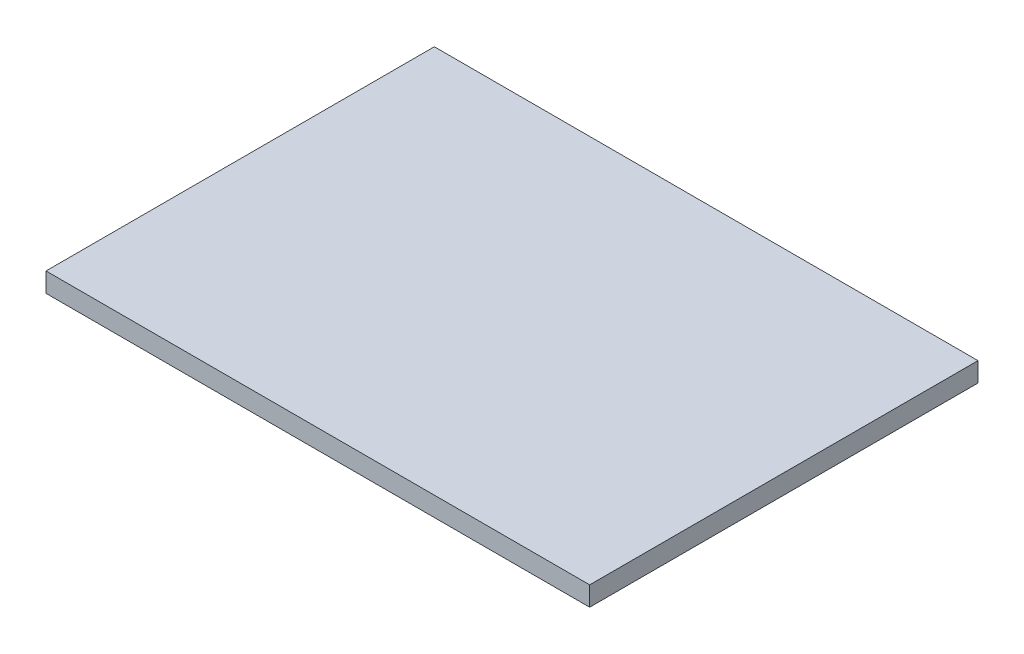
ISO-10303-21;
HEADER;
FILE_DESCRIPTION(('STEP AP214'),'2;1');
FILE_NAME('part.step','',(''),(''),'','','');
FILE_SCHEMA(('AUTOMOTIVE_DESIGN { 1 0 10303 214 1 1 1 1 }'));
ENDSEC;
DATA;
#1=APPLICATION_CONTEXT('core data for automotive mechanical design processes');
#2=APPLICATION_PROTOCOL_DEFINITION('international standard','automotive_design',2000,#1);
#3=PRODUCT_CONTEXT('',#1,'mechanical');
#4=PRODUCT('Part','Part','',(#3));
#5=PRODUCT_RELATED_PRODUCT_CATEGORY('part','',(#4));
#6=PRODUCT_DEFINITION_FORMATION('','',#4);
#7=PRODUCT_DEFINITION_CONTEXT('part definition',#1,'design');
#8=PRODUCT_DEFINITION('design','',#6,#7);
#9=PRODUCT_DEFINITION_SHAPE('','',#8);
#10=(LENGTH_UNIT() NAMED_UNIT(*) SI_UNIT(.MILLI.,.METRE.));
#11=(NAMED_UNIT(*) PLANE_ANGLE_UNIT() SI_UNIT($,.RADIAN.));
#12=(NAMED_UNIT(*) SI_UNIT($,.STERADIAN.) SOLID_ANGLE_UNIT());
#13=UNCERTAINTY_MEASURE_WITH_UNIT(LENGTH_MEASURE(1.E-05),#10,'distance_accuracy_value','');
#14=(GEOMETRIC_REPRESENTATION_CONTEXT(3) GLOBAL_UNCERTAINTY_ASSIGNED_CONTEXT((#13)) GLOBAL_UNIT_ASSIGNED_CONTEXT((#10,
#11,#12)) REPRESENTATION_CONTEXT('',''));
#15=CARTESIAN_POINT('',(0.,0.,0.));
#16=DIRECTION('',(0.,0.,1.));
#17=DIRECTION('',(1.,0.,0.));
#18=AXIS2_PLACEMENT_3D('',#15,#16,#17);
#19=CARTESIAN_POINT('',(-350.,25.,250.));
#20=DIRECTION('',(1.,0.,0.));
#21=DIRECTION('',(0.,0.,-1.));
#22=AXIS2_PLACEMENT_3D('',#19,#20,#21);
#23=PLANE('',#22);
#24=DIRECTION('',(0.,0.,1.));
#25=VECTOR('',#24,1.);
#26=CARTESIAN_POINT('',(-350.,0.,250.));
#27=LINE('',#26,#25);
#28=CARTESIAN_POINT('',(-350.,0.,-250.));
#29=VERTEX_POINT('',#28);
#30=CARTESIAN_POINT('',(-350.,0.,250.));
#31=VERTEX_POINT('',#30);
#32=EDGE_CURVE('E107',#29,#31,#27,.T.);
#33=ORIENTED_EDGE('',*,*,#32,.T.);
#34=DIRECTION('',(0.,-1.,0.));
#35=VECTOR('',#34,1.);
#36=CARTESIAN_POINT('',(-350.,25.,250.));
#37=LINE('',#36,#35);
#38=CARTESIAN_POINT('',(-350.,25.,250.));
#39=VERTEX_POINT('',#38);
#40=EDGE_CURVE('E11',#39,#31,#37,.T.);
#41=ORIENTED_EDGE('',*,*,#40,.F.);
#42=DIRECTION('',(0.,0.,1.));
#43=VECTOR('',#42,1.);
#44=CARTESIAN_POINT('',(-350.,25.,250.));
#45=LINE('',#44,#43);
#46=CARTESIAN_POINT('',(-350.,25.,-250.));
#47=VERTEX_POINT('',#46);
#48=EDGE_CURVE('E91',#47,#39,#45,.T.);
#49=ORIENTED_EDGE('',*,*,#48,.F.);
#50=DIRECTION('',(0.,-1.,0.));
#51=VECTOR('',#50,1.);
#52=CARTESIAN_POINT('',(-350.,25.,-250.));
#53=LINE('',#52,#51);
#54=EDGE_CURVE('E103',#47,#29,#53,.T.);
#55=ORIENTED_EDGE('',*,*,#54,.T.);
#56=EDGE_LOOP('',(#33,#41,#49,#55));
#57=FACE_BOUND('',#56,.T.);
#58=ADVANCED_FACE('F39',(#57),#23,.F.);
#59=CARTESIAN_POINT('',(-350.,25.,250.));
#60=DIRECTION('',(0.,0.,-1.));
#61=DIRECTION('',(-1.,0.,0.));
#62=AXIS2_PLACEMENT_3D('',#59,#60,#61);
#63=PLANE('',#62);
#64=DIRECTION('',(1.,0.,0.));
#65=VECTOR('',#64,1.);
#66=CARTESIAN_POINT('',(-350.,0.,250.));
#67=LINE('',#66,#65);
#68=CARTESIAN_POINT('',(350.,0.,250.));
#69=VERTEX_POINT('',#68);
#70=EDGE_CURVE('E96',#31,#69,#67,.T.);
#71=ORIENTED_EDGE('',*,*,#70,.T.);
#72=DIRECTION('',(0.,-1.,0.));
#73=VECTOR('',#72,1.);
#74=CARTESIAN_POINT('',(350.,25.,250.));
#75=LINE('',#74,#73);
#76=CARTESIAN_POINT('',(350.,25.,250.));
#77=VERTEX_POINT('',#76);
#78=EDGE_CURVE('E48',#77,#69,#75,.T.);
#79=ORIENTED_EDGE('',*,*,#78,.F.);
#80=DIRECTION('',(1.,0.,0.));
#81=VECTOR('',#80,1.);
#82=CARTESIAN_POINT('',(-350.,25.,250.));
#83=LINE('',#82,#81);
#84=EDGE_CURVE('E86',#39,#77,#83,.T.);
#85=ORIENTED_EDGE('',*,*,#84,.F.);
#86=ORIENTED_EDGE('',*,*,#40,.T.);
#87=EDGE_LOOP('',(#71,#79,#85,#86));
#88=FACE_BOUND('',#87,.T.);
#89=ADVANCED_FACE('F95',(#88),#63,.F.);
#90=CARTESIAN_POINT('',(350.,25.,250.));
#91=DIRECTION('',(-1.,0.,0.));
#92=DIRECTION('',(0.,0.,1.));
#93=AXIS2_PLACEMENT_3D('',#90,#91,#92);
#94=PLANE('',#93);
#95=DIRECTION('',(0.,0.,-1.));
#96=VECTOR('',#95,1.);
#97=CARTESIAN_POINT('',(350.,0.,250.));
#98=LINE('',#97,#96);
#99=CARTESIAN_POINT('',(350.,0.,-250.));
#100=VERTEX_POINT('',#99);
#101=EDGE_CURVE('E73',#69,#100,#98,.T.);
#102=ORIENTED_EDGE('',*,*,#101,.T.);
#103=DIRECTION('',(0.,-1.,0.));
#104=VECTOR('',#103,1.);
#105=CARTESIAN_POINT('',(350.,25.,-250.));
#106=LINE('',#105,#104);
#107=CARTESIAN_POINT('',(350.,25.,-250.));
#108=VERTEX_POINT('',#107);
#109=EDGE_CURVE('E98',#108,#100,#106,.T.);
#110=ORIENTED_EDGE('',*,*,#109,.F.);
#111=DIRECTION('',(0.,0.,-1.));
#112=VECTOR('',#111,1.);
#113=CARTESIAN_POINT('',(350.,25.,250.));
#114=LINE('',#113,#112);
#115=EDGE_CURVE('E89',#77,#108,#114,.T.);
#116=ORIENTED_EDGE('',*,*,#115,.F.);
#117=ORIENTED_EDGE('',*,*,#78,.T.);
#118=EDGE_LOOP('',(#102,#110,#116,#117));
#119=FACE_BOUND('',#118,.T.);
#120=ADVANCED_FACE('F99',(#119),#94,.F.);
#121=CARTESIAN_POINT('',(-350.,25.,-250.));
#122=DIRECTION('',(0.,0.,1.));
#123=DIRECTION('',(1.,0.,0.));
#124=AXIS2_PLACEMENT_3D('',#121,#122,#123);
#125=PLANE('',#124);
#126=DIRECTION('',(-1.,0.,0.));
#127=VECTOR('',#126,1.);
#128=CARTESIAN_POINT('',(-350.,0.,-250.));
#129=LINE('',#128,#127);
#130=EDGE_CURVE('E79',#100,#29,#129,.T.);
#131=ORIENTED_EDGE('',*,*,#130,.T.);
#132=ORIENTED_EDGE('',*,*,#54,.F.);
#133=DIRECTION('',(-1.,0.,0.));
#134=VECTOR('',#133,1.);
#135=CARTESIAN_POINT('',(-350.,25.,-250.));
#136=LINE('',#135,#134);
#137=EDGE_CURVE('E56',#108,#47,#136,.T.);
#138=ORIENTED_EDGE('',*,*,#137,.F.);
#139=ORIENTED_EDGE('',*,*,#109,.T.);
#140=EDGE_LOOP('',(#131,#132,#138,#139));
#141=FACE_BOUND('',#140,.T.);
#142=ADVANCED_FACE('F120',(#141),#125,.F.);
#143=CARTESIAN_POINT('',(0.,25.,0.));
#144=DIRECTION('',(0.,-1.,0.));
#145=DIRECTION('',(0.,0.,-1.));
#146=AXIS2_PLACEMENT_3D('',#143,#144,#145);
#147=PLANE('',#146);
#148=ORIENTED_EDGE('',*,*,#48,.T.);
#149=ORIENTED_EDGE('',*,*,#84,.T.);
#150=ORIENTED_EDGE('',*,*,#115,.T.);
#151=ORIENTED_EDGE('',*,*,#137,.T.);
#152=EDGE_LOOP('',(#148,#149,#150,#151));
#153=FACE_BOUND('',#152,.T.);
#154=ADVANCED_FACE('F87',(#153),#147,.F.);
#155=CARTESIAN_POINT('',(0.,0.,0.));
#156=DIRECTION('',(0.,-1.,0.));
#157=DIRECTION('',(0.,0.,-1.));
#158=AXIS2_PLACEMENT_3D('',#155,#156,#157);
#159=PLANE('',#158);
#160=ORIENTED_EDGE('',*,*,#32,.F.);
#161=ORIENTED_EDGE('',*,*,#130,.F.);
#162=ORIENTED_EDGE('',*,*,#101,.F.);
#163=ORIENTED_EDGE('',*,*,#70,.F.);
#164=EDGE_LOOP('',(#160,#161,#162,#163));
#165=FACE_BOUND('',#164,.T.);
#166=ADVANCED_FACE('F123',(#165),#159,.T.);
#167=CLOSED_SHELL('',(#58,#89,#120,#142,#154,#166));
#168=MANIFOLD_SOLID_BREP('B2',#167);
#169=ADVANCED_BREP_SHAPE_REPRESENTATION('',(#18,#168),#14);
#170=SHAPE_DEFINITION_REPRESENTATION(#9,#169);
ENDSEC;
END-ISO-10303-21;
